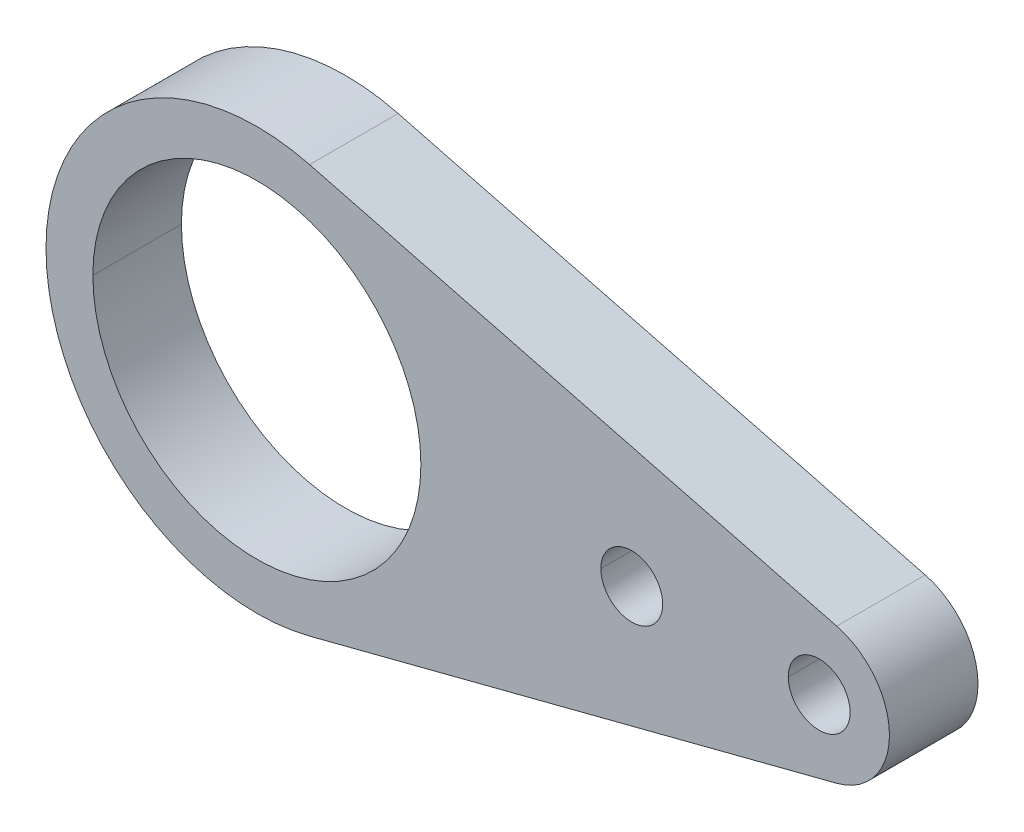
ISO-10303-21;
HEADER;
FILE_DESCRIPTION(('STEP AP214'),'2;1');
FILE_NAME('part.step','',(''),(''),'','','');
FILE_SCHEMA(('AUTOMOTIVE_DESIGN { 1 0 10303 214 1 1 1 1 }'));
ENDSEC;
DATA;
#1=APPLICATION_CONTEXT('core data for automotive mechanical design processes');
#2=APPLICATION_PROTOCOL_DEFINITION('international standard','automotive_design',2000,#1);
#3=PRODUCT_CONTEXT('',#1,'mechanical');
#4=PRODUCT('Part','Part','',(#3));
#5=PRODUCT_RELATED_PRODUCT_CATEGORY('part','',(#4));
#6=PRODUCT_DEFINITION_FORMATION('','',#4);
#7=PRODUCT_DEFINITION_CONTEXT('part definition',#1,'design');
#8=PRODUCT_DEFINITION('design','',#6,#7);
#9=PRODUCT_DEFINITION_SHAPE('','',#8);
#10=(LENGTH_UNIT() NAMED_UNIT(*) SI_UNIT(.MILLI.,.METRE.));
#11=(NAMED_UNIT(*) PLANE_ANGLE_UNIT() SI_UNIT($,.RADIAN.));
#12=(NAMED_UNIT(*) SI_UNIT($,.STERADIAN.) SOLID_ANGLE_UNIT());
#13=UNCERTAINTY_MEASURE_WITH_UNIT(LENGTH_MEASURE(1.E-05),#10,'distance_accuracy_value','');
#14=(GEOMETRIC_REPRESENTATION_CONTEXT(3) GLOBAL_UNCERTAINTY_ASSIGNED_CONTEXT((#13)) GLOBAL_UNIT_ASSIGNED_CONTEXT((#10,
#11,#12)) REPRESENTATION_CONTEXT('',''));
#15=CARTESIAN_POINT('',(0.,0.,0.));
#16=DIRECTION('',(0.,0.,1.));
#17=DIRECTION('',(1.,0.,0.));
#18=AXIS2_PLACEMENT_3D('',#15,#16,#17);
#19=CARTESIAN_POINT('',(25.4,0.,3.));
#20=DIRECTION('',(0.,0.,1.));
#21=DIRECTION('',(1.,0.,0.));
#22=AXIS2_PLACEMENT_3D('',#19,#20,#21);
#23=CYLINDRICAL_SURFACE('',#22,2.0955);
#24=DIRECTION('',(0.,0.,1.));
#25=VECTOR('',#24,1.);
#26=CARTESIAN_POINT('',(23.3045,0.,3.));
#27=LINE('',#26,#25);
#28=CARTESIAN_POINT('',(23.3045,0.,-3.));
#29=VERTEX_POINT('',#28);
#30=CARTESIAN_POINT('',(23.3045,0.,3.));
#31=VERTEX_POINT('',#30);
#32=EDGE_CURVE('E170',#29,#31,#27,.T.);
#33=ORIENTED_EDGE('',*,*,#32,.F.);
#34=CARTESIAN_POINT('',(25.4,0.,-3.));
#35=DIRECTION('',(0.,0.,1.));
#36=DIRECTION('',(1.,0.,0.));
#37=AXIS2_PLACEMENT_3D('',#34,#35,#36);
#38=CIRCLE('',#37,2.0955);
#39=CARTESIAN_POINT('',(27.4955,0.,-3.));
#40=VERTEX_POINT('',#39);
#41=EDGE_CURVE('E25',#40,#29,#38,.T.);
#42=ORIENTED_EDGE('',*,*,#41,.F.);
#43=DIRECTION('',(0.,0.,1.));
#44=VECTOR('',#43,1.);
#45=CARTESIAN_POINT('',(27.4955,0.,3.));
#46=LINE('',#45,#44);
#47=CARTESIAN_POINT('',(27.4955,0.,3.));
#48=VERTEX_POINT('',#47);
#49=EDGE_CURVE('E192',#40,#48,#46,.T.);
#50=ORIENTED_EDGE('',*,*,#49,.T.);
#51=CARTESIAN_POINT('',(25.4,0.,3.));
#52=DIRECTION('',(0.,0.,1.));
#53=DIRECTION('',(1.,0.,0.));
#54=AXIS2_PLACEMENT_3D('',#51,#52,#53);
#55=CIRCLE('',#54,2.0955);
#56=EDGE_CURVE('E85',#48,#31,#55,.T.);
#57=ORIENTED_EDGE('',*,*,#56,.T.);
#58=EDGE_LOOP('',(#33,#42,#50,#57));
#59=FACE_BOUND('',#58,.T.);
#60=ADVANCED_FACE('F14',(#59),#23,.F.);
#61=CARTESIAN_POINT('',(38.1,0.,3.));
#62=DIRECTION('',(0.,0.,1.));
#63=DIRECTION('',(1.,0.,0.));
#64=AXIS2_PLACEMENT_3D('',#61,#62,#63);
#65=CYLINDRICAL_SURFACE('',#64,2.0955);
#66=DIRECTION('',(0.,0.,1.));
#67=VECTOR('',#66,1.);
#68=CARTESIAN_POINT('',(36.0045,0.,3.));
#69=LINE('',#68,#67);
#70=CARTESIAN_POINT('',(36.0045,0.,-3.));
#71=VERTEX_POINT('',#70);
#72=CARTESIAN_POINT('',(36.0045,0.,3.));
#73=VERTEX_POINT('',#72);
#74=EDGE_CURVE('E184',#71,#73,#69,.T.);
#75=ORIENTED_EDGE('',*,*,#74,.F.);
#76=CARTESIAN_POINT('',(38.1,0.,-3.));
#77=DIRECTION('',(0.,0.,1.));
#78=DIRECTION('',(1.,0.,0.));
#79=AXIS2_PLACEMENT_3D('',#76,#77,#78);
#80=CIRCLE('',#79,2.0955);
#81=CARTESIAN_POINT('',(40.1955,0.,-3.));
#82=VERTEX_POINT('',#81);
#83=EDGE_CURVE('E9',#82,#71,#80,.T.);
#84=ORIENTED_EDGE('',*,*,#83,.F.);
#85=DIRECTION('',(0.,0.,1.));
#86=VECTOR('',#85,1.);
#87=CARTESIAN_POINT('',(40.1955,0.,3.));
#88=LINE('',#87,#86);
#89=CARTESIAN_POINT('',(40.1955,0.,3.));
#90=VERTEX_POINT('',#89);
#91=EDGE_CURVE('E216',#82,#90,#88,.T.);
#92=ORIENTED_EDGE('',*,*,#91,.T.);
#93=CARTESIAN_POINT('',(38.1,0.,3.));
#94=DIRECTION('',(0.,0.,1.));
#95=DIRECTION('',(1.,0.,0.));
#96=AXIS2_PLACEMENT_3D('',#93,#94,#95);
#97=CIRCLE('',#96,2.0955);
#98=EDGE_CURVE('E180',#90,#73,#97,.T.);
#99=ORIENTED_EDGE('',*,*,#98,.T.);
#100=EDGE_LOOP('',(#75,#84,#92,#99));
#101=FACE_BOUND('',#100,.T.);
#102=ADVANCED_FACE('F247',(#101),#65,.F.);
#103=CARTESIAN_POINT('',(0.,0.,-3.));
#104=DIRECTION('',(0.,0.,1.));
#105=DIRECTION('',(1.,0.,0.));
#106=AXIS2_PLACEMENT_3D('',#103,#104,#105);
#107=PLANE('',#106);
#108=CARTESIAN_POINT('',(0.,0.,-3.));
#109=DIRECTION('',(0.,0.,1.));
#110=DIRECTION('',(1.,0.,0.));
#111=AXIS2_PLACEMENT_3D('',#108,#109,#110);
#112=CIRCLE('',#111,11.1125);
#113=CARTESIAN_POINT('',(-11.1125,0.,-3.));
#114=VERTEX_POINT('',#113);
#115=CARTESIAN_POINT('',(11.1125,0.,-3.));
#116=VERTEX_POINT('',#115);
#117=EDGE_CURVE('E161',#114,#116,#112,.T.);
#118=ORIENTED_EDGE('',*,*,#117,.T.);
#119=CARTESIAN_POINT('',(0.,0.,-3.));
#120=DIRECTION('',(0.,0.,1.));
#121=DIRECTION('',(1.,0.,0.));
#122=AXIS2_PLACEMENT_3D('',#119,#120,#121);
#123=CIRCLE('',#122,11.1125);
#124=EDGE_CURVE('E175',#116,#114,#123,.T.);
#125=ORIENTED_EDGE('',*,*,#124,.T.);
#126=EDGE_LOOP('',(#118,#125));
#127=FACE_BOUND('',#126,.T.);
#128=ORIENTED_EDGE('',*,*,#83,.T.);
#129=CARTESIAN_POINT('',(38.1,0.,-3.));
#130=DIRECTION('',(0.,0.,1.));
#131=DIRECTION('',(1.,0.,0.));
#132=AXIS2_PLACEMENT_3D('',#129,#130,#131);
#133=CIRCLE('',#132,2.0955);
#134=EDGE_CURVE('E189',#71,#82,#133,.T.);
#135=ORIENTED_EDGE('',*,*,#134,.T.);
#136=EDGE_LOOP('',(#128,#135));
#137=FACE_BOUND('',#136,.T.);
#138=ORIENTED_EDGE('',*,*,#41,.T.);
#139=CARTESIAN_POINT('',(25.4,0.,-3.));
#140=DIRECTION('',(0.,0.,1.));
#141=DIRECTION('',(1.,0.,0.));
#142=AXIS2_PLACEMENT_3D('',#139,#140,#141);
#143=CIRCLE('',#142,2.0955);
#144=EDGE_CURVE('E166',#29,#40,#143,.T.);
#145=ORIENTED_EDGE('',*,*,#144,.T.);
#146=EDGE_LOOP('',(#138,#145));
#147=FACE_BOUND('',#146,.T.);
#148=DIRECTION('',(0.968245836551854,-0.25,0.));
#149=VECTOR('',#148,1.);
#150=CARTESIAN_POINT('',(3.571875,13.8338123897346,-3.));
#151=LINE('',#150,#149);
#152=CARTESIAN_POINT('',(3.571875,13.8338123897346,-3.));
#153=VERTEX_POINT('',#152);
#154=CARTESIAN_POINT('',(39.290625,4.61127079657821,-3.));
#155=VERTEX_POINT('',#154);
#156=EDGE_CURVE('E205',#153,#155,#151,.T.);
#157=ORIENTED_EDGE('',*,*,#156,.T.);
#158=CARTESIAN_POINT('',(38.1,0.,-3.));
#159=DIRECTION('',(0.,0.,1.));
#160=DIRECTION('',(1.,0.,0.));
#161=AXIS2_PLACEMENT_3D('',#158,#159,#160);
#162=CIRCLE('',#161,4.7625);
#163=CARTESIAN_POINT('',(39.290625,-4.61127079657821,-3.));
#164=VERTEX_POINT('',#163);
#165=EDGE_CURVE('E165',#164,#155,#162,.T.);
#166=ORIENTED_EDGE('',*,*,#165,.F.);
#167=DIRECTION('',(-0.968245836551854,-0.25,0.));
#168=VECTOR('',#167,1.);
#169=CARTESIAN_POINT('',(3.571875,-13.8338123897346,-3.));
#170=LINE('',#169,#168);
#171=CARTESIAN_POINT('',(3.571875,-13.8338123897346,-3.));
#172=VERTEX_POINT('',#171);
#173=EDGE_CURVE('E129',#164,#172,#170,.T.);
#174=ORIENTED_EDGE('',*,*,#173,.T.);
#175=CARTESIAN_POINT('',(0.,0.,-3.));
#176=DIRECTION('',(0.,0.,1.));
#177=DIRECTION('',(1.,0.,0.));
#178=AXIS2_PLACEMENT_3D('',#175,#176,#177);
#179=CIRCLE('',#178,14.2875);
#180=CARTESIAN_POINT('',(-14.2875,0.,-3.));
#181=VERTEX_POINT('',#180);
#182=EDGE_CURVE('E133',#181,#172,#179,.T.);
#183=ORIENTED_EDGE('',*,*,#182,.F.);
#184=CARTESIAN_POINT('',(0.,0.,-3.));
#185=DIRECTION('',(0.,0.,1.));
#186=DIRECTION('',(1.,0.,0.));
#187=AXIS2_PLACEMENT_3D('',#184,#185,#186);
#188=CIRCLE('',#187,14.2875);
#189=EDGE_CURVE('E116',#153,#181,#188,.T.);
#190=ORIENTED_EDGE('',*,*,#189,.F.);
#191=EDGE_LOOP('',(#157,#166,#174,#183,#190));
#192=FACE_BOUND('',#191,.T.);
#193=ADVANCED_FACE('F134',(#127,#137,#147,#192),#107,.F.);
#194=CARTESIAN_POINT('',(0.,0.,3.));
#195=DIRECTION('',(0.,0.,1.));
#196=DIRECTION('',(1.,0.,0.));
#197=AXIS2_PLACEMENT_3D('',#194,#195,#196);
#198=PLANE('',#197);
#199=CARTESIAN_POINT('',(0.,0.,3.));
#200=DIRECTION('',(0.,0.,1.));
#201=DIRECTION('',(1.,0.,0.));
#202=AXIS2_PLACEMENT_3D('',#199,#200,#201);
#203=CIRCLE('',#202,11.1125);
#204=CARTESIAN_POINT('',(-11.1125,0.,3.));
#205=VERTEX_POINT('',#204);
#206=CARTESIAN_POINT('',(11.1125,0.,3.));
#207=VERTEX_POINT('',#206);
#208=EDGE_CURVE('E162',#205,#207,#203,.T.);
#209=ORIENTED_EDGE('',*,*,#208,.F.);
#210=CARTESIAN_POINT('',(0.,0.,3.));
#211=DIRECTION('',(0.,0.,1.));
#212=DIRECTION('',(1.,0.,0.));
#213=AXIS2_PLACEMENT_3D('',#210,#211,#212);
#214=CIRCLE('',#213,11.1125);
#215=EDGE_CURVE('E174',#207,#205,#214,.T.);
#216=ORIENTED_EDGE('',*,*,#215,.F.);
#217=EDGE_LOOP('',(#209,#216));
#218=FACE_BOUND('',#217,.T.);
#219=ORIENTED_EDGE('',*,*,#98,.F.);
#220=CARTESIAN_POINT('',(38.1,0.,3.));
#221=DIRECTION('',(0.,0.,1.));
#222=DIRECTION('',(1.,0.,0.));
#223=AXIS2_PLACEMENT_3D('',#220,#221,#222);
#224=CIRCLE('',#223,2.0955);
#225=EDGE_CURVE('E188',#73,#90,#224,.T.);
#226=ORIENTED_EDGE('',*,*,#225,.F.);
#227=EDGE_LOOP('',(#219,#226));
#228=FACE_BOUND('',#227,.T.);
#229=ORIENTED_EDGE('',*,*,#56,.F.);
#230=CARTESIAN_POINT('',(25.4,0.,3.));
#231=DIRECTION('',(0.,0.,1.));
#232=DIRECTION('',(1.,0.,0.));
#233=AXIS2_PLACEMENT_3D('',#230,#231,#232);
#234=CIRCLE('',#233,2.0955);
#235=EDGE_CURVE('E155',#31,#48,#234,.T.);
#236=ORIENTED_EDGE('',*,*,#235,.F.);
#237=EDGE_LOOP('',(#229,#236));
#238=FACE_BOUND('',#237,.T.);
#239=DIRECTION('',(0.968245836551854,-0.25,0.));
#240=VECTOR('',#239,1.);
#241=CARTESIAN_POINT('',(3.571875,13.8338123897346,3.));
#242=LINE('',#241,#240);
#243=CARTESIAN_POINT('',(3.571875,13.8338123897346,3.));
#244=VERTEX_POINT('',#243);
#245=CARTESIAN_POINT('',(39.290625,4.61127079657821,3.));
#246=VERTEX_POINT('',#245);
#247=EDGE_CURVE('E193',#244,#246,#242,.T.);
#248=ORIENTED_EDGE('',*,*,#247,.F.);
#249=CARTESIAN_POINT('',(0.,0.,3.));
#250=DIRECTION('',(0.,0.,1.));
#251=DIRECTION('',(1.,0.,0.));
#252=AXIS2_PLACEMENT_3D('',#249,#250,#251);
#253=CIRCLE('',#252,14.2875);
#254=CARTESIAN_POINT('',(-14.2875,0.,3.));
#255=VERTEX_POINT('',#254);
#256=EDGE_CURVE('E130',#244,#255,#253,.T.);
#257=ORIENTED_EDGE('',*,*,#256,.T.);
#258=CARTESIAN_POINT('',(0.,0.,3.));
#259=DIRECTION('',(0.,0.,1.));
#260=DIRECTION('',(1.,0.,0.));
#261=AXIS2_PLACEMENT_3D('',#258,#259,#260);
#262=CIRCLE('',#261,14.2875);
#263=CARTESIAN_POINT('',(3.571875,-13.8338123897346,3.));
#264=VERTEX_POINT('',#263);
#265=EDGE_CURVE('E144',#255,#264,#262,.T.);
#266=ORIENTED_EDGE('',*,*,#265,.T.);
#267=DIRECTION('',(-0.968245836551854,-0.25,0.));
#268=VECTOR('',#267,1.);
#269=CARTESIAN_POINT('',(3.571875,-13.8338123897346,3.));
#270=LINE('',#269,#268);
#271=CARTESIAN_POINT('',(39.290625,-4.61127079657821,3.));
#272=VERTEX_POINT('',#271);
#273=EDGE_CURVE('E171',#272,#264,#270,.T.);
#274=ORIENTED_EDGE('',*,*,#273,.F.);
#275=CARTESIAN_POINT('',(38.1,0.,3.));
#276=DIRECTION('',(0.,0.,1.));
#277=DIRECTION('',(1.,0.,0.));
#278=AXIS2_PLACEMENT_3D('',#275,#276,#277);
#279=CIRCLE('',#278,4.7625);
#280=EDGE_CURVE('E40',#272,#246,#279,.T.);
#281=ORIENTED_EDGE('',*,*,#280,.T.);
#282=EDGE_LOOP('',(#248,#257,#266,#274,#281));
#283=FACE_BOUND('',#282,.T.);
#284=ADVANCED_FACE('F256',(#218,#228,#238,#283),#198,.T.);
#285=CARTESIAN_POINT('',(38.1,0.,3.));
#286=DIRECTION('',(0.,0.,-1.));
#287=DIRECTION('',(-1.,0.,0.));
#288=AXIS2_PLACEMENT_3D('',#285,#286,#287);
#289=CYLINDRICAL_SURFACE('',#288,4.7625);
#290=ORIENTED_EDGE('',*,*,#165,.T.);
#291=DIRECTION('',(0.,0.,-1.));
#292=VECTOR('',#291,1.);
#293=CARTESIAN_POINT('',(39.290625,4.61127079657821,3.));
#294=LINE('',#293,#292);
#295=EDGE_CURVE('E196',#246,#155,#294,.T.);
#296=ORIENTED_EDGE('',*,*,#295,.F.);
#297=ORIENTED_EDGE('',*,*,#280,.F.);
#298=DIRECTION('',(0.,0.,-1.));
#299=VECTOR('',#298,1.);
#300=CARTESIAN_POINT('',(39.290625,-4.61127079657821,3.));
#301=LINE('',#300,#299);
#302=EDGE_CURVE('E18',#272,#164,#301,.T.);
#303=ORIENTED_EDGE('',*,*,#302,.T.);
#304=EDGE_LOOP('',(#290,#296,#297,#303));
#305=FACE_BOUND('',#304,.T.);
#306=ADVANCED_FACE('F391',(#305),#289,.T.);
#307=CARTESIAN_POINT('',(0.,0.,3.));
#308=DIRECTION('',(0.,0.,-1.));
#309=DIRECTION('',(-1.,0.,0.));
#310=AXIS2_PLACEMENT_3D('',#307,#308,#309);
#311=CYLINDRICAL_SURFACE('',#310,11.1125);
#312=DIRECTION('',(0.,0.,-1.));
#313=VECTOR('',#312,1.);
#314=CARTESIAN_POINT('',(11.1125,0.,3.));
#315=LINE('',#314,#313);
#316=EDGE_CURVE('E157',#207,#116,#315,.T.);
#317=ORIENTED_EDGE('',*,*,#316,.F.);
#318=ORIENTED_EDGE('',*,*,#215,.T.);
#319=DIRECTION('',(0.,0.,-1.));
#320=VECTOR('',#319,1.);
#321=CARTESIAN_POINT('',(-11.1125,0.,3.));
#322=LINE('',#321,#320);
#323=EDGE_CURVE('E151',#205,#114,#322,.T.);
#324=ORIENTED_EDGE('',*,*,#323,.T.);
#325=ORIENTED_EDGE('',*,*,#124,.F.);
#326=EDGE_LOOP('',(#317,#318,#324,#325));
#327=FACE_BOUND('',#326,.T.);
#328=ADVANCED_FACE('F275',(#327),#311,.F.);
#329=CARTESIAN_POINT('',(3.571875,-13.8338123897346,3.));
#330=DIRECTION('',(0.25,-0.968245836551854,0.));
#331=DIRECTION('',(0.,0.,-1.));
#332=AXIS2_PLACEMENT_3D('',#329,#330,#331);
#333=PLANE('',#332);
#334=ORIENTED_EDGE('',*,*,#173,.F.);
#335=ORIENTED_EDGE('',*,*,#302,.F.);
#336=ORIENTED_EDGE('',*,*,#273,.T.);
#337=DIRECTION('',(0.,0.,-1.));
#338=VECTOR('',#337,1.);
#339=CARTESIAN_POINT('',(3.571875,-13.8338123897346,3.));
#340=LINE('',#339,#338);
#341=EDGE_CURVE('E140',#264,#172,#340,.T.);
#342=ORIENTED_EDGE('',*,*,#341,.T.);
#343=EDGE_LOOP('',(#334,#335,#336,#342));
#344=FACE_BOUND('',#343,.T.);
#345=ADVANCED_FACE('F427',(#344),#333,.T.);
#346=CARTESIAN_POINT('',(0.,0.,3.));
#347=DIRECTION('',(0.,0.,-1.));
#348=DIRECTION('',(-1.,0.,0.));
#349=AXIS2_PLACEMENT_3D('',#346,#347,#348);
#350=CYLINDRICAL_SURFACE('',#349,14.2875);
#351=DIRECTION('',(0.,0.,-1.));
#352=VECTOR('',#351,1.);
#353=CARTESIAN_POINT('',(-14.2875,0.,3.));
#354=LINE('',#353,#352);
#355=EDGE_CURVE('E121',#255,#181,#354,.T.);
#356=ORIENTED_EDGE('',*,*,#355,.F.);
#357=ORIENTED_EDGE('',*,*,#256,.F.);
#358=DIRECTION('',(0.,0.,-1.));
#359=VECTOR('',#358,1.);
#360=CARTESIAN_POINT('',(3.571875,13.8338123897346,3.));
#361=LINE('',#360,#359);
#362=EDGE_CURVE('E124',#244,#153,#361,.T.);
#363=ORIENTED_EDGE('',*,*,#362,.T.);
#364=ORIENTED_EDGE('',*,*,#189,.T.);
#365=EDGE_LOOP('',(#356,#357,#363,#364));
#366=FACE_BOUND('',#365,.T.);
#367=ADVANCED_FACE('F118',(#366),#350,.T.);
#368=CARTESIAN_POINT('',(3.571875,13.8338123897346,3.));
#369=DIRECTION('',(0.25,0.968245836551854,0.));
#370=DIRECTION('',(0.,0.,-1.));
#371=AXIS2_PLACEMENT_3D('',#368,#369,#370);
#372=PLANE('',#371);
#373=ORIENTED_EDGE('',*,*,#156,.F.);
#374=ORIENTED_EDGE('',*,*,#362,.F.);
#375=ORIENTED_EDGE('',*,*,#247,.T.);
#376=ORIENTED_EDGE('',*,*,#295,.T.);
#377=EDGE_LOOP('',(#373,#374,#375,#376));
#378=FACE_BOUND('',#377,.T.);
#379=ADVANCED_FACE('F404',(#378),#372,.T.);
#380=CARTESIAN_POINT('',(0.,0.,3.));
#381=DIRECTION('',(0.,0.,-1.));
#382=DIRECTION('',(-1.,0.,0.));
#383=AXIS2_PLACEMENT_3D('',#380,#381,#382);
#384=CYLINDRICAL_SURFACE('',#383,14.2875);
#385=ORIENTED_EDGE('',*,*,#265,.F.);
#386=ORIENTED_EDGE('',*,*,#355,.T.);
#387=ORIENTED_EDGE('',*,*,#182,.T.);
#388=ORIENTED_EDGE('',*,*,#341,.F.);
#389=EDGE_LOOP('',(#385,#386,#387,#388));
#390=FACE_BOUND('',#389,.T.);
#391=ADVANCED_FACE('F142',(#390),#384,.T.);
#392=CARTESIAN_POINT('',(0.,0.,3.));
#393=DIRECTION('',(0.,0.,-1.));
#394=DIRECTION('',(-1.,0.,0.));
#395=AXIS2_PLACEMENT_3D('',#392,#393,#394);
#396=CYLINDRICAL_SURFACE('',#395,11.1125);
#397=ORIENTED_EDGE('',*,*,#208,.T.);
#398=ORIENTED_EDGE('',*,*,#316,.T.);
#399=ORIENTED_EDGE('',*,*,#117,.F.);
#400=ORIENTED_EDGE('',*,*,#323,.F.);
#401=EDGE_LOOP('',(#397,#398,#399,#400));
#402=FACE_BOUND('',#401,.T.);
#403=ADVANCED_FACE('F16',(#402),#396,.F.);
#404=CARTESIAN_POINT('',(38.1,0.,3.));
#405=DIRECTION('',(0.,0.,1.));
#406=DIRECTION('',(1.,0.,0.));
#407=AXIS2_PLACEMENT_3D('',#404,#405,#406);
#408=CYLINDRICAL_SURFACE('',#407,2.0955);
#409=ORIENTED_EDGE('',*,*,#134,.F.);
#410=ORIENTED_EDGE('',*,*,#74,.T.);
#411=ORIENTED_EDGE('',*,*,#225,.T.);
#412=ORIENTED_EDGE('',*,*,#91,.F.);
#413=EDGE_LOOP('',(#409,#410,#411,#412));
#414=FACE_BOUND('',#413,.T.);
#415=ADVANCED_FACE('F254',(#414),#408,.F.);
#416=CARTESIAN_POINT('',(25.4,0.,3.));
#417=DIRECTION('',(0.,0.,1.));
#418=DIRECTION('',(1.,0.,0.));
#419=AXIS2_PLACEMENT_3D('',#416,#417,#418);
#420=CYLINDRICAL_SURFACE('',#419,2.0955);
#421=ORIENTED_EDGE('',*,*,#144,.F.);
#422=ORIENTED_EDGE('',*,*,#32,.T.);
#423=ORIENTED_EDGE('',*,*,#235,.T.);
#424=ORIENTED_EDGE('',*,*,#49,.F.);
#425=EDGE_LOOP('',(#421,#422,#423,#424));
#426=FACE_BOUND('',#425,.T.);
#427=ADVANCED_FACE('F348',(#426),#420,.F.);
#428=CLOSED_SHELL('',(#60,#102,#193,#284,#306,#328,#345,#367,#379,#391,#403,#415,#427));
#429=MANIFOLD_SOLID_BREP('B1',#428);
#430=ADVANCED_BREP_SHAPE_REPRESENTATION('',(#18,#429),#14);
#431=SHAPE_DEFINITION_REPRESENTATION(#9,#430);
ENDSEC;
END-ISO-10303-21;
